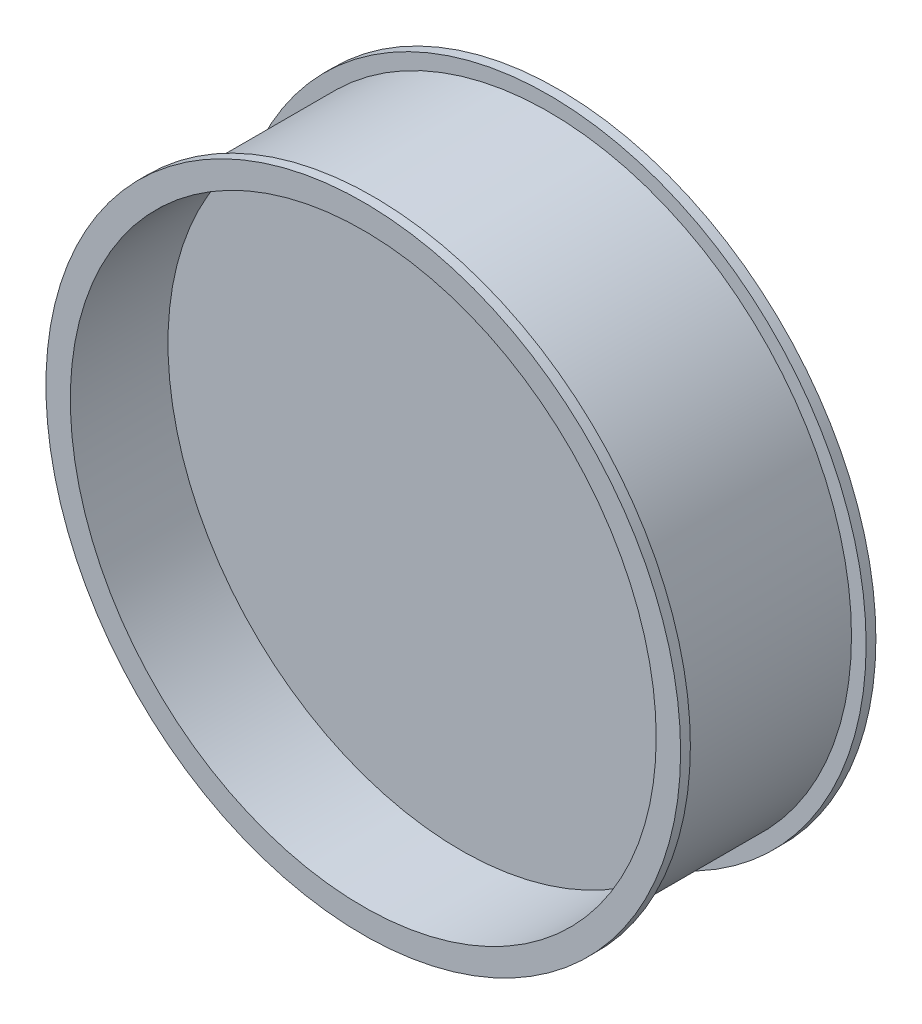
ISO-10303-21;
HEADER;
FILE_DESCRIPTION(('STEP AP214'),'2;1');
FILE_NAME('part.step','',(''),(''),'','','');
FILE_SCHEMA(('AUTOMOTIVE_DESIGN { 1 0 10303 214 1 1 1 1 }'));
ENDSEC;
DATA;
#1=APPLICATION_CONTEXT('core data for automotive mechanical design processes');
#2=APPLICATION_PROTOCOL_DEFINITION('international standard','automotive_design',2000,#1);
#3=PRODUCT_CONTEXT('',#1,'mechanical');
#4=PRODUCT('Part','Part','',(#3));
#5=PRODUCT_RELATED_PRODUCT_CATEGORY('part','',(#4));
#6=PRODUCT_DEFINITION_FORMATION('','',#4);
#7=PRODUCT_DEFINITION_CONTEXT('part definition',#1,'design');
#8=PRODUCT_DEFINITION('design','',#6,#7);
#9=PRODUCT_DEFINITION_SHAPE('','',#8);
#10=(LENGTH_UNIT() NAMED_UNIT(*) SI_UNIT(.MILLI.,.METRE.));
#11=(NAMED_UNIT(*) PLANE_ANGLE_UNIT() SI_UNIT($,.RADIAN.));
#12=(NAMED_UNIT(*) SI_UNIT($,.STERADIAN.) SOLID_ANGLE_UNIT());
#13=UNCERTAINTY_MEASURE_WITH_UNIT(LENGTH_MEASURE(1.E-05),#10,'distance_accuracy_value','');
#14=(GEOMETRIC_REPRESENTATION_CONTEXT(3) GLOBAL_UNCERTAINTY_ASSIGNED_CONTEXT((#13)) GLOBAL_UNIT_ASSIGNED_CONTEXT((#10,
#11,#12)) REPRESENTATION_CONTEXT('',''));
#15=CARTESIAN_POINT('',(0.,0.,0.));
#16=DIRECTION('',(0.,0.,1.));
#17=DIRECTION('',(1.,0.,0.));
#18=AXIS2_PLACEMENT_3D('',#15,#16,#17);
#19=CARTESIAN_POINT('',(0.,0.,1.));
#20=DIRECTION('',(0.,0.,-1.));
#21=DIRECTION('',(-1.,0.,0.));
#22=AXIS2_PLACEMENT_3D('',#19,#20,#21);
#23=CYLINDRICAL_SURFACE('',#22,32.5);
#24=CARTESIAN_POINT('',(0.,0.,1.));
#25=DIRECTION('',(0.,0.,1.));
#26=DIRECTION('',(1.,0.,0.));
#27=AXIS2_PLACEMENT_3D('',#24,#25,#26);
#28=CIRCLE('',#27,32.5);
#29=CARTESIAN_POINT('',(32.5,0.,1.));
#30=VERTEX_POINT('',#29);
#31=EDGE_CURVE('E43',#30,#30,#28,.T.);
#32=ORIENTED_EDGE('',*,*,#31,.F.);
#33=EDGE_LOOP('',(#32));
#34=FACE_BOUND('',#33,.T.);
#35=CARTESIAN_POINT('',(0.,0.,0.));
#36=DIRECTION('',(0.,0.,1.));
#37=DIRECTION('',(1.,0.,0.));
#38=AXIS2_PLACEMENT_3D('',#35,#36,#37);
#39=CIRCLE('',#38,32.5);
#40=CARTESIAN_POINT('',(32.5,0.,0.));
#41=VERTEX_POINT('',#40);
#42=EDGE_CURVE('E39',#41,#41,#39,.T.);
#43=ORIENTED_EDGE('',*,*,#42,.T.);
#44=EDGE_LOOP('',(#43));
#45=FACE_BOUND('',#44,.T.);
#46=ADVANCED_FACE('F36',(#34,#45),#23,.T.);
#47=CARTESIAN_POINT('',(0.,0.,1.));
#48=DIRECTION('',(0.,0.,1.));
#49=DIRECTION('',(1.,0.,0.));
#50=AXIS2_PLACEMENT_3D('',#47,#48,#49);
#51=PLANE('',#50);
#52=CARTESIAN_POINT('',(0.,0.,1.));
#53=DIRECTION('',(0.,0.,1.));
#54=DIRECTION('',(1.,0.,0.));
#55=AXIS2_PLACEMENT_3D('',#52,#53,#54);
#56=CIRCLE('',#55,31.);
#57=CARTESIAN_POINT('',(31.,0.,1.));
#58=VERTEX_POINT('',#57);
#59=EDGE_CURVE('E10',#58,#58,#56,.T.);
#60=ORIENTED_EDGE('',*,*,#59,.F.);
#61=EDGE_LOOP('',(#60));
#62=FACE_BOUND('',#61,.T.);
#63=ORIENTED_EDGE('',*,*,#31,.T.);
#64=EDGE_LOOP('',(#63));
#65=FACE_BOUND('',#64,.T.);
#66=ADVANCED_FACE('F93',(#62,#65),#51,.T.);
#67=CARTESIAN_POINT('',(0.,0.,0.));
#68=DIRECTION('',(0.,0.,1.));
#69=DIRECTION('',(1.,0.,0.));
#70=AXIS2_PLACEMENT_3D('',#67,#68,#69);
#71=PLANE('',#70);
#72=ORIENTED_EDGE('',*,*,#42,.F.);
#73=EDGE_LOOP('',(#72));
#74=FACE_BOUND('',#73,.T.);
#75=ADVANCED_FACE('F98',(#74),#71,.F.);
#76=CARTESIAN_POINT('',(0.,0.,19.));
#77=DIRECTION('',(0.,0.,-1.));
#78=DIRECTION('',(-1.,0.,0.));
#79=AXIS2_PLACEMENT_3D('',#76,#77,#78);
#80=CYLINDRICAL_SURFACE('',#79,31.);
#81=CARTESIAN_POINT('',(0.,0.,19.));
#82=DIRECTION('',(0.,0.,1.));
#83=DIRECTION('',(1.,0.,0.));
#84=AXIS2_PLACEMENT_3D('',#81,#82,#83);
#85=CIRCLE('',#84,31.);
#86=CARTESIAN_POINT('',(31.,0.,19.));
#87=VERTEX_POINT('',#86);
#88=EDGE_CURVE('E49',#87,#87,#85,.T.);
#89=ORIENTED_EDGE('',*,*,#88,.F.);
#90=EDGE_LOOP('',(#89));
#91=FACE_BOUND('',#90,.T.);
#92=ORIENTED_EDGE('',*,*,#59,.T.);
#93=EDGE_LOOP('',(#92));
#94=FACE_BOUND('',#93,.T.);
#95=ADVANCED_FACE('F83',(#91,#94),#80,.T.);
#96=CARTESIAN_POINT('',(0.,0.,20.));
#97=DIRECTION('',(0.,0.,-1.));
#98=DIRECTION('',(-1.,0.,0.));
#99=AXIS2_PLACEMENT_3D('',#96,#97,#98);
#100=CYLINDRICAL_SURFACE('',#99,32.5);
#101=CARTESIAN_POINT('',(0.,0.,20.));
#102=DIRECTION('',(0.,0.,1.));
#103=DIRECTION('',(1.,0.,0.));
#104=AXIS2_PLACEMENT_3D('',#101,#102,#103);
#105=CIRCLE('',#104,32.5);
#106=CARTESIAN_POINT('',(32.5,0.,20.));
#107=VERTEX_POINT('',#106);
#108=EDGE_CURVE('E52',#107,#107,#105,.T.);
#109=ORIENTED_EDGE('',*,*,#108,.F.);
#110=EDGE_LOOP('',(#109));
#111=FACE_BOUND('',#110,.T.);
#112=CARTESIAN_POINT('',(0.,0.,19.));
#113=DIRECTION('',(0.,0.,1.));
#114=DIRECTION('',(1.,0.,0.));
#115=AXIS2_PLACEMENT_3D('',#112,#113,#114);
#116=CIRCLE('',#115,32.5);
#117=CARTESIAN_POINT('',(32.5,0.,19.));
#118=VERTEX_POINT('',#117);
#119=EDGE_CURVE('E53',#118,#118,#116,.T.);
#120=ORIENTED_EDGE('',*,*,#119,.T.);
#121=EDGE_LOOP('',(#120));
#122=FACE_BOUND('',#121,.T.);
#123=ADVANCED_FACE('F77',(#111,#122),#100,.T.);
#124=CARTESIAN_POINT('',(0.,0.,20.));
#125=DIRECTION('',(0.,0.,1.));
#126=DIRECTION('',(1.,0.,0.));
#127=AXIS2_PLACEMENT_3D('',#124,#125,#126);
#128=PLANE('',#127);
#129=CARTESIAN_POINT('',(0.,0.,20.));
#130=DIRECTION('',(0.,0.,1.));
#131=DIRECTION('',(1.,0.,0.));
#132=AXIS2_PLACEMENT_3D('',#129,#130,#131);
#133=CIRCLE('',#132,30.);
#134=CARTESIAN_POINT('',(30.,0.,20.));
#135=VERTEX_POINT('',#134);
#136=EDGE_CURVE('E59',#135,#135,#133,.T.);
#137=ORIENTED_EDGE('',*,*,#136,.F.);
#138=EDGE_LOOP('',(#137));
#139=FACE_BOUND('',#138,.T.);
#140=ORIENTED_EDGE('',*,*,#108,.T.);
#141=EDGE_LOOP('',(#140));
#142=FACE_BOUND('',#141,.T.);
#143=ADVANCED_FACE('F74',(#139,#142),#128,.T.);
#144=CARTESIAN_POINT('',(0.,0.,19.));
#145=DIRECTION('',(0.,0.,1.));
#146=DIRECTION('',(1.,0.,0.));
#147=AXIS2_PLACEMENT_3D('',#144,#145,#146);
#148=PLANE('',#147);
#149=ORIENTED_EDGE('',*,*,#88,.T.);
#150=EDGE_LOOP('',(#149));
#151=FACE_BOUND('',#150,.T.);
#152=ORIENTED_EDGE('',*,*,#119,.F.);
#153=EDGE_LOOP('',(#152));
#154=FACE_BOUND('',#153,.T.);
#155=ADVANCED_FACE('F70',(#151,#154),#148,.F.);
#156=CARTESIAN_POINT('',(0.,0.,10.));
#157=DIRECTION('',(0.,0.,1.));
#158=DIRECTION('',(1.,0.,0.));
#159=AXIS2_PLACEMENT_3D('',#156,#157,#158);
#160=CYLINDRICAL_SURFACE('',#159,30.);
#161=CARTESIAN_POINT('',(0.,0.,10.));
#162=DIRECTION('',(0.,0.,1.));
#163=DIRECTION('',(1.,0.,0.));
#164=AXIS2_PLACEMENT_3D('',#161,#162,#163);
#165=CIRCLE('',#164,30.);
#166=CARTESIAN_POINT('',(30.,0.,10.));
#167=VERTEX_POINT('',#166);
#168=EDGE_CURVE('E56',#167,#167,#165,.T.);
#169=ORIENTED_EDGE('',*,*,#168,.F.);
#170=EDGE_LOOP('',(#169));
#171=FACE_BOUND('',#170,.T.);
#172=ORIENTED_EDGE('',*,*,#136,.T.);
#173=EDGE_LOOP('',(#172));
#174=FACE_BOUND('',#173,.T.);
#175=ADVANCED_FACE('F67',(#171,#174),#160,.F.);
#176=CARTESIAN_POINT('',(0.,0.,10.));
#177=DIRECTION('',(0.,0.,1.));
#178=DIRECTION('',(1.,0.,0.));
#179=AXIS2_PLACEMENT_3D('',#176,#177,#178);
#180=PLANE('',#179);
#181=ORIENTED_EDGE('',*,*,#168,.T.);
#182=EDGE_LOOP('',(#181));
#183=FACE_BOUND('',#182,.T.);
#184=ADVANCED_FACE('F65',(#183),#180,.T.);
#185=CLOSED_SHELL('',(#46,#66,#75,#95,#123,#143,#155,#175,#184));
#186=MANIFOLD_SOLID_BREP('B2',#185);
#187=ADVANCED_BREP_SHAPE_REPRESENTATION('',(#18,#186),#14);
#188=SHAPE_DEFINITION_REPRESENTATION(#9,#187);
ENDSEC;
END-ISO-10303-21;
